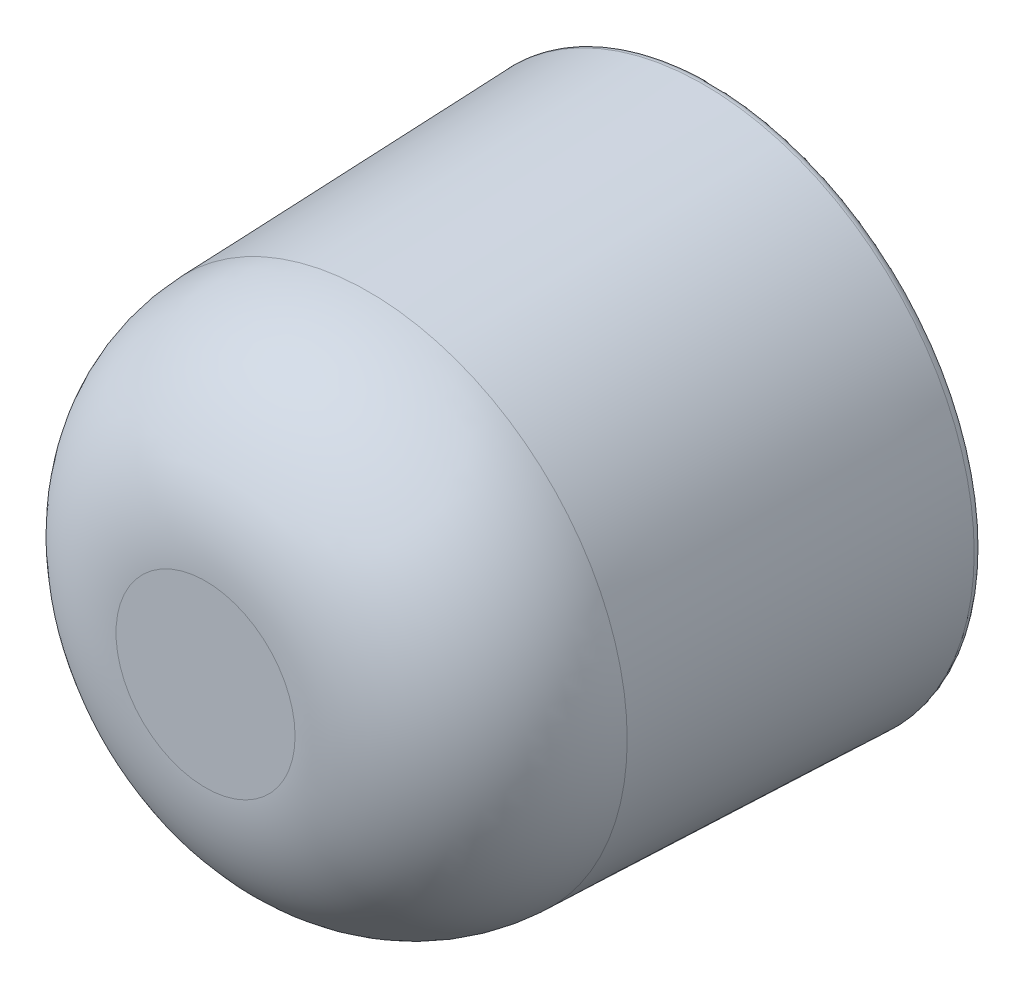
ISO-10303-21;
HEADER;
FILE_DESCRIPTION(('STEP AP214'),'2;1');
FILE_NAME('part.step','',(''),(''),'','','');
FILE_SCHEMA(('AUTOMOTIVE_DESIGN { 1 0 10303 214 1 1 1 1 }'));
ENDSEC;
DATA;
#1=APPLICATION_CONTEXT('core data for automotive mechanical design processes');
#2=APPLICATION_PROTOCOL_DEFINITION('international standard','automotive_design',2000,#1);
#3=PRODUCT_CONTEXT('',#1,'mechanical');
#4=PRODUCT('Part','Part','',(#3));
#5=PRODUCT_RELATED_PRODUCT_CATEGORY('part','',(#4));
#6=PRODUCT_DEFINITION_FORMATION('','',#4);
#7=PRODUCT_DEFINITION_CONTEXT('part definition',#1,'design');
#8=PRODUCT_DEFINITION('design','',#6,#7);
#9=PRODUCT_DEFINITION_SHAPE('','',#8);
#10=(LENGTH_UNIT() NAMED_UNIT(*) SI_UNIT(.MILLI.,.METRE.));
#11=(NAMED_UNIT(*) PLANE_ANGLE_UNIT() SI_UNIT($,.RADIAN.));
#12=(NAMED_UNIT(*) SI_UNIT($,.STERADIAN.) SOLID_ANGLE_UNIT());
#13=UNCERTAINTY_MEASURE_WITH_UNIT(LENGTH_MEASURE(1.E-05),#10,'distance_accuracy_value','');
#14=(GEOMETRIC_REPRESENTATION_CONTEXT(3) GLOBAL_UNCERTAINTY_ASSIGNED_CONTEXT((#13)) GLOBAL_UNIT_ASSIGNED_CONTEXT((#10,
#11,#12)) REPRESENTATION_CONTEXT('',''));
#15=CARTESIAN_POINT('',(0.,0.,0.));
#16=DIRECTION('',(0.,0.,1.));
#17=DIRECTION('',(1.,0.,0.));
#18=AXIS2_PLACEMENT_3D('',#15,#16,#17);
#19=CARTESIAN_POINT('',(0.,0.,0.));
#20=DIRECTION('',(0.,0.,-1.));
#21=DIRECTION('',(1.,0.,0.));
#22=AXIS2_PLACEMENT_3D('',#19,#20,#21);
#23=CONICAL_SURFACE('',#22,8.,0.0349065850398866);
#24=CARTESIAN_POINT('',(0.,0.,0.258724874175609));
#25=DIRECTION('',(0.,0.,1.));
#26=DIRECTION('',(1.,0.,0.));
#27=AXIS2_PLACEMENT_3D('',#24,#25,#26);
#28=CIRCLE('',#27,7.99096512830713);
#29=CARTESIAN_POINT('',(7.99096512830713,0.,0.258724874175609));
#30=VERTEX_POINT('',#29);
#31=EDGE_CURVE('E45',#30,#30,#28,.T.);
#32=ORIENTED_EDGE('',*,*,#31,.T.);
#33=EDGE_LOOP('',(#32));
#34=FACE_BOUND('',#33,.T.);
#35=CARTESIAN_POINT('',(0.,0.,10.1744974835125));
#36=DIRECTION('',(0.,0.,-1.));
#37=DIRECTION('',(-1.,0.,0.));
#38=AXIS2_PLACEMENT_3D('',#35,#36,#37);
#39=CIRCLE('',#38,7.64469871868389);
#40=CARTESIAN_POINT('',(-7.64469871868389,0.,10.1744974835125));
#41=VERTEX_POINT('',#40);
#42=EDGE_CURVE('E50',#41,#41,#39,.T.);
#43=ORIENTED_EDGE('',*,*,#42,.T.);
#44=EDGE_LOOP('',(#43));
#45=FACE_BOUND('',#44,.T.);
#46=ADVANCED_FACE('F37',(#34,#45),#23,.T.);
#47=CARTESIAN_POINT('',(0.,0.,15.));
#48=DIRECTION('',(0.,0.,1.));
#49=DIRECTION('',(1.,0.,0.));
#50=AXIS2_PLACEMENT_3D('',#47,#48,#49);
#51=PLANE('',#50);
#52=CARTESIAN_POINT('',(0.,0.,15.));
#53=DIRECTION('',(0.,0.,1.));
#54=DIRECTION('',(1.,0.,0.));
#55=AXIS2_PLACEMENT_3D('',#52,#53,#54);
#56=CIRCLE('',#55,2.64774458358841);
#57=CARTESIAN_POINT('',(2.64774458358841,0.,15.));
#58=VERTEX_POINT('',#57);
#59=EDGE_CURVE('E55',#58,#58,#56,.T.);
#60=ORIENTED_EDGE('',*,*,#59,.T.);
#61=EDGE_LOOP('',(#60));
#62=FACE_BOUND('',#61,.T.);
#63=ADVANCED_FACE('F91',(#62),#51,.T.);
#64=CARTESIAN_POINT('',(0.,0.,0.));
#65=DIRECTION('',(0.,0.,1.));
#66=DIRECTION('',(1.,0.,0.));
#67=AXIS2_PLACEMENT_3D('',#64,#65,#66);
#68=PLANE('',#67);
#69=CARTESIAN_POINT('',(0.,0.,0.));
#70=DIRECTION('',(0.,0.,1.));
#71=DIRECTION('',(1.,0.,0.));
#72=AXIS2_PLACEMENT_3D('',#69,#70,#71);
#73=CIRCLE('',#72,7.74111742155236);
#74=CARTESIAN_POINT('',(7.74111742155236,0.,0.));
#75=VERTEX_POINT('',#74);
#76=EDGE_CURVE('E10',#75,#75,#73,.F.);
#77=ORIENTED_EDGE('',*,*,#76,.T.);
#78=EDGE_LOOP('',(#77));
#79=FACE_BOUND('',#78,.T.);
#80=CARTESIAN_POINT('',(0.,0.,0.));
#81=DIRECTION('',(0.,0.,-1.));
#82=DIRECTION('',(-1.,0.,0.));
#83=AXIS2_PLACEMENT_3D('',#80,#81,#82);
#84=CIRCLE('',#83,7.5);
#85=CARTESIAN_POINT('',(-7.5,0.,0.));
#86=VERTEX_POINT('',#85);
#87=EDGE_CURVE('E70',#86,#86,#84,.T.);
#88=ORIENTED_EDGE('',*,*,#87,.F.);
#89=EDGE_LOOP('',(#88));
#90=FACE_BOUND('',#89,.T.);
#91=ADVANCED_FACE('F88',(#79,#90),#68,.F.);
#92=CARTESIAN_POINT('',(0.,0.,10.));
#93=DIRECTION('',(0.,0.,1.));
#94=DIRECTION('',(1.,0.,0.));
#95=AXIS2_PLACEMENT_3D('',#92,#93,#94);
#96=DEGENERATE_TOROIDAL_SURFACE('',#95,2.64774458358841,5.,.T.);
#97=ORIENTED_EDGE('',*,*,#42,.F.);
#98=EDGE_LOOP('',(#97));
#99=FACE_BOUND('',#98,.T.);
#100=ORIENTED_EDGE('',*,*,#59,.F.);
#101=EDGE_LOOP('',(#100));
#102=FACE_BOUND('',#101,.T.);
#103=ADVANCED_FACE('F90',(#99,#102),#96,.T.);
#104=CARTESIAN_POINT('',(0.,0.,5.));
#105=DIRECTION('',(0.,0.,-1.));
#106=DIRECTION('',(-1.,0.,0.));
#107=AXIS2_PLACEMENT_3D('',#104,#105,#106);
#108=PLANE('',#107);
#109=CARTESIAN_POINT('',(0.,0.,5.));
#110=DIRECTION('',(0.,0.,-1.));
#111=DIRECTION('',(-1.,0.,0.));
#112=AXIS2_PLACEMENT_3D('',#109,#110,#111);
#113=CIRCLE('',#112,7.5);
#114=CARTESIAN_POINT('',(-7.5,0.,5.));
#115=VERTEX_POINT('',#114);
#116=EDGE_CURVE('E62',#115,#115,#113,.T.);
#117=ORIENTED_EDGE('',*,*,#116,.T.);
#118=EDGE_LOOP('',(#117));
#119=FACE_BOUND('',#118,.T.);
#120=CARTESIAN_POINT('',(0.,0.,5.));
#121=DIRECTION('',(0.,0.,-1.));
#122=DIRECTION('',(-1.,0.,0.));
#123=AXIS2_PLACEMENT_3D('',#120,#121,#122);
#124=CIRCLE('',#123,3.);
#125=CARTESIAN_POINT('',(-3.,0.,5.));
#126=VERTEX_POINT('',#125);
#127=EDGE_CURVE('E58',#126,#126,#124,.F.);
#128=ORIENTED_EDGE('',*,*,#127,.T.);
#129=EDGE_LOOP('',(#128));
#130=FACE_BOUND('',#129,.T.);
#131=ADVANCED_FACE('F78',(#119,#130),#108,.T.);
#132=CARTESIAN_POINT('',(0.,0.,5.));
#133=DIRECTION('',(0.,0.,-1.));
#134=DIRECTION('',(-1.,0.,0.));
#135=AXIS2_PLACEMENT_3D('',#132,#133,#134);
#136=CYLINDRICAL_SURFACE('',#135,7.5);
#137=ORIENTED_EDGE('',*,*,#116,.F.);
#138=EDGE_LOOP('',(#137));
#139=FACE_BOUND('',#138,.T.);
#140=ORIENTED_EDGE('',*,*,#87,.T.);
#141=EDGE_LOOP('',(#140));
#142=FACE_BOUND('',#141,.T.);
#143=ADVANCED_FACE('F81',(#139,#142),#136,.F.);
#144=CARTESIAN_POINT('',(0.,0.,12.));
#145=DIRECTION('',(0.,0.,-1.));
#146=DIRECTION('',(-1.,0.,0.));
#147=AXIS2_PLACEMENT_3D('',#144,#145,#146);
#148=PLANE('',#147);
#149=CARTESIAN_POINT('',(0.,0.,12.));
#150=DIRECTION('',(0.,0.,-1.));
#151=DIRECTION('',(-1.,0.,0.));
#152=AXIS2_PLACEMENT_3D('',#149,#150,#151);
#153=CIRCLE('',#152,3.);
#154=CARTESIAN_POINT('',(-3.,0.,12.));
#155=VERTEX_POINT('',#154);
#156=EDGE_CURVE('E61',#155,#155,#153,.T.);
#157=ORIENTED_EDGE('',*,*,#156,.T.);
#158=EDGE_LOOP('',(#157));
#159=FACE_BOUND('',#158,.T.);
#160=ADVANCED_FACE('F84',(#159),#148,.T.);
#161=CARTESIAN_POINT('',(0.,0.,12.));
#162=DIRECTION('',(0.,0.,-1.));
#163=DIRECTION('',(-1.,0.,0.));
#164=AXIS2_PLACEMENT_3D('',#161,#162,#163);
#165=CYLINDRICAL_SURFACE('',#164,3.);
#166=ORIENTED_EDGE('',*,*,#156,.F.);
#167=EDGE_LOOP('',(#166));
#168=FACE_BOUND('',#167,.T.);
#169=ORIENTED_EDGE('',*,*,#127,.F.);
#170=EDGE_LOOP('',(#169));
#171=FACE_BOUND('',#170,.T.);
#172=ADVANCED_FACE('F130',(#168,#171),#165,.F.);
#173=CARTESIAN_POINT('',(0.,0.,0.25));
#174=DIRECTION('',(0.,0.,1.));
#175=DIRECTION('',(1.,0.,0.));
#176=AXIS2_PLACEMENT_3D('',#173,#174,#175);
#177=TOROIDAL_SURFACE('',#176,7.74111742155236,0.25);
#178=ORIENTED_EDGE('',*,*,#76,.F.);
#179=EDGE_LOOP('',(#178));
#180=FACE_BOUND('',#179,.T.);
#181=ORIENTED_EDGE('',*,*,#31,.F.);
#182=EDGE_LOOP('',(#181));
#183=FACE_BOUND('',#182,.T.);
#184=ADVANCED_FACE('F39',(#180,#183),#177,.T.);
#185=CLOSED_SHELL('',(#46,#63,#91,#103,#131,#143,#160,#172,#184));
#186=MANIFOLD_SOLID_BREP('B2',#185);
#187=ADVANCED_BREP_SHAPE_REPRESENTATION('',(#18,#186),#14);
#188=SHAPE_DEFINITION_REPRESENTATION(#9,#187);
ENDSEC;
END-ISO-10303-21;
